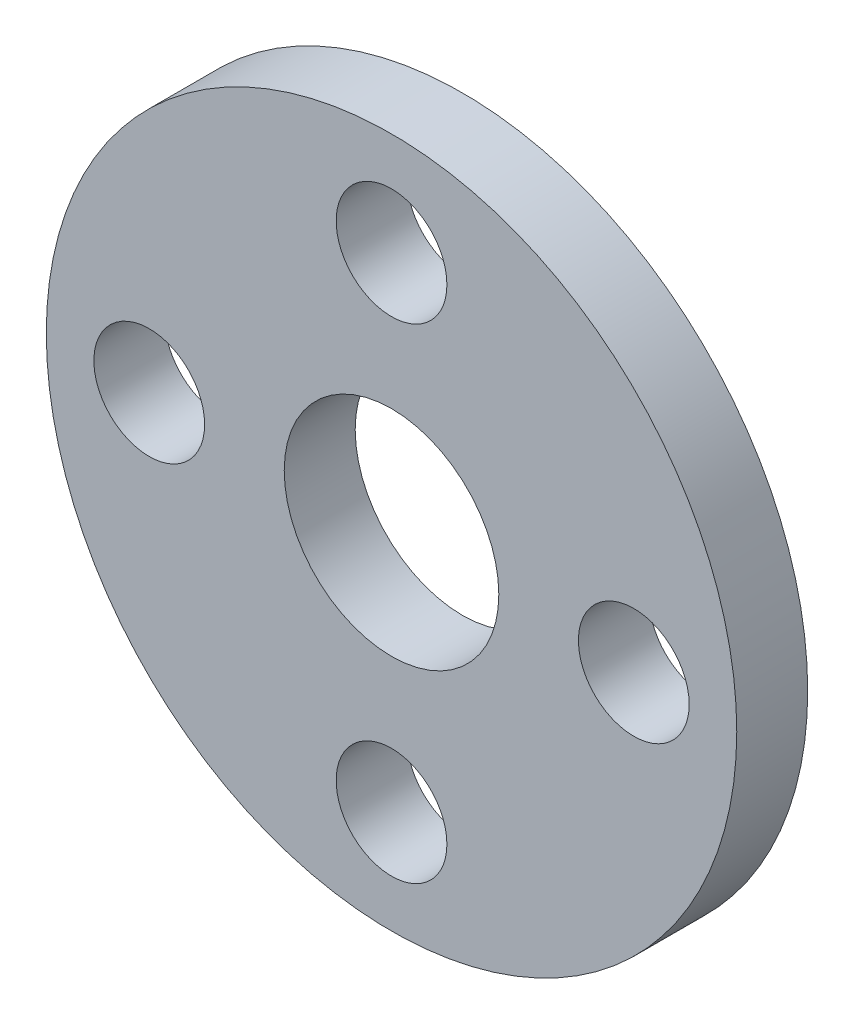
ISO-10303-21;
HEADER;
FILE_DESCRIPTION(('STEP AP214'),'2;1');
FILE_NAME('part.step','',(''),(''),'','','');
FILE_SCHEMA(('AUTOMOTIVE_DESIGN { 1 0 10303 214 1 1 1 1 }'));
ENDSEC;
DATA;
#1=APPLICATION_CONTEXT('core data for automotive mechanical design processes');
#2=APPLICATION_PROTOCOL_DEFINITION('international standard','automotive_design',2000,#1);
#3=PRODUCT_CONTEXT('',#1,'mechanical');
#4=PRODUCT('Part','Part','',(#3));
#5=PRODUCT_RELATED_PRODUCT_CATEGORY('part','',(#4));
#6=PRODUCT_DEFINITION_FORMATION('','',#4);
#7=PRODUCT_DEFINITION_CONTEXT('part definition',#1,'design');
#8=PRODUCT_DEFINITION('design','',#6,#7);
#9=PRODUCT_DEFINITION_SHAPE('','',#8);
#10=(LENGTH_UNIT() NAMED_UNIT(*) SI_UNIT(.MILLI.,.METRE.));
#11=(NAMED_UNIT(*) PLANE_ANGLE_UNIT() SI_UNIT($,.RADIAN.));
#12=(NAMED_UNIT(*) SI_UNIT($,.STERADIAN.) SOLID_ANGLE_UNIT());
#13=UNCERTAINTY_MEASURE_WITH_UNIT(LENGTH_MEASURE(1.E-05),#10,'distance_accuracy_value','');
#14=(GEOMETRIC_REPRESENTATION_CONTEXT(3) GLOBAL_UNCERTAINTY_ASSIGNED_CONTEXT((#13)) GLOBAL_UNIT_ASSIGNED_CONTEXT((#10,
#11,#12)) REPRESENTATION_CONTEXT('',''));
#15=CARTESIAN_POINT('',(0.,0.,0.));
#16=DIRECTION('',(0.,0.,1.));
#17=DIRECTION('',(1.,0.,0.));
#18=AXIS2_PLACEMENT_3D('',#15,#16,#17);
#19=CARTESIAN_POINT('',(0.,7.,-3.05));
#20=DIRECTION('',(0.,0.,1.));
#21=DIRECTION('',(1.,0.,0.));
#22=AXIS2_PLACEMENT_3D('',#19,#20,#21);
#23=CYLINDRICAL_SURFACE('',#22,1.6);
#24=CARTESIAN_POINT('',(0.,7.,0.));
#25=DIRECTION('',(0.,0.,1.));
#26=DIRECTION('',(1.,0.,0.));
#27=AXIS2_PLACEMENT_3D('',#24,#25,#26);
#28=CIRCLE('',#27,1.6);
#29=CARTESIAN_POINT('',(1.6,7.,0.));
#30=VERTEX_POINT('',#29);
#31=EDGE_CURVE('E49',#30,#30,#28,.T.);
#32=ORIENTED_EDGE('',*,*,#31,.T.);
#33=EDGE_LOOP('',(#32));
#34=FACE_BOUND('',#33,.T.);
#35=CARTESIAN_POINT('',(0.,7.,-2.05));
#36=DIRECTION('',(0.,0.,1.));
#37=DIRECTION('',(1.,0.,0.));
#38=AXIS2_PLACEMENT_3D('',#35,#36,#37);
#39=CIRCLE('',#38,1.6);
#40=CARTESIAN_POINT('',(1.6,7.,-2.05));
#41=VERTEX_POINT('',#40);
#42=EDGE_CURVE('E9',#41,#41,#39,.T.);
#43=ORIENTED_EDGE('',*,*,#42,.F.);
#44=EDGE_LOOP('',(#43));
#45=FACE_BOUND('',#44,.T.);
#46=ADVANCED_FACE('F14',(#34,#45),#23,.F.);
#47=CARTESIAN_POINT('',(7.,0.,-3.05));
#48=DIRECTION('',(0.,0.,1.));
#49=DIRECTION('',(1.,0.,0.));
#50=AXIS2_PLACEMENT_3D('',#47,#48,#49);
#51=CYLINDRICAL_SURFACE('',#50,1.6);
#52=CARTESIAN_POINT('',(7.,0.,0.));
#53=DIRECTION('',(0.,0.,1.));
#54=DIRECTION('',(1.,0.,0.));
#55=AXIS2_PLACEMENT_3D('',#52,#53,#54);
#56=CIRCLE('',#55,1.6);
#57=CARTESIAN_POINT('',(8.6,0.,0.));
#58=VERTEX_POINT('',#57);
#59=EDGE_CURVE('E45',#58,#58,#56,.T.);
#60=ORIENTED_EDGE('',*,*,#59,.T.);
#61=EDGE_LOOP('',(#60));
#62=FACE_BOUND('',#61,.T.);
#63=CARTESIAN_POINT('',(7.,0.,-2.05));
#64=DIRECTION('',(0.,0.,1.));
#65=DIRECTION('',(1.,0.,0.));
#66=AXIS2_PLACEMENT_3D('',#63,#64,#65);
#67=CIRCLE('',#66,1.6);
#68=CARTESIAN_POINT('',(8.6,0.,-2.05));
#69=VERTEX_POINT('',#68);
#70=EDGE_CURVE('E22',#69,#69,#67,.T.);
#71=ORIENTED_EDGE('',*,*,#70,.F.);
#72=EDGE_LOOP('',(#71));
#73=FACE_BOUND('',#72,.T.);
#74=ADVANCED_FACE('F104',(#62,#73),#51,.F.);
#75=CARTESIAN_POINT('',(0.,0.,-3.05));
#76=DIRECTION('',(0.,0.,1.));
#77=DIRECTION('',(1.,0.,0.));
#78=AXIS2_PLACEMENT_3D('',#75,#76,#77);
#79=CYLINDRICAL_SURFACE('',#78,3.1);
#80=CARTESIAN_POINT('',(0.,0.,0.));
#81=DIRECTION('',(0.,0.,1.));
#82=DIRECTION('',(1.,0.,0.));
#83=AXIS2_PLACEMENT_3D('',#80,#81,#82);
#84=CIRCLE('',#83,3.1);
#85=CARTESIAN_POINT('',(3.1,0.,0.));
#86=VERTEX_POINT('',#85);
#87=EDGE_CURVE('E41',#86,#86,#84,.T.);
#88=ORIENTED_EDGE('',*,*,#87,.T.);
#89=EDGE_LOOP('',(#88));
#90=FACE_BOUND('',#89,.T.);
#91=CARTESIAN_POINT('',(0.,0.,-2.05));
#92=DIRECTION('',(0.,0.,1.));
#93=DIRECTION('',(1.,0.,0.));
#94=AXIS2_PLACEMENT_3D('',#91,#92,#93);
#95=CIRCLE('',#94,3.1);
#96=CARTESIAN_POINT('',(3.1,0.,-2.05));
#97=VERTEX_POINT('',#96);
#98=EDGE_CURVE('E17',#97,#97,#95,.T.);
#99=ORIENTED_EDGE('',*,*,#98,.F.);
#100=EDGE_LOOP('',(#99));
#101=FACE_BOUND('',#100,.T.);
#102=ADVANCED_FACE('F108',(#90,#101),#79,.F.);
#103=CARTESIAN_POINT('',(-7.,0.,-3.05));
#104=DIRECTION('',(0.,0.,1.));
#105=DIRECTION('',(1.,0.,0.));
#106=AXIS2_PLACEMENT_3D('',#103,#104,#105);
#107=CYLINDRICAL_SURFACE('',#106,1.6);
#108=CARTESIAN_POINT('',(-7.,0.,0.));
#109=DIRECTION('',(0.,0.,1.));
#110=DIRECTION('',(1.,0.,0.));
#111=AXIS2_PLACEMENT_3D('',#108,#109,#110);
#112=CIRCLE('',#111,1.6);
#113=CARTESIAN_POINT('',(-5.4,0.,0.));
#114=VERTEX_POINT('',#113);
#115=EDGE_CURVE('E37',#114,#114,#112,.T.);
#116=ORIENTED_EDGE('',*,*,#115,.T.);
#117=EDGE_LOOP('',(#116));
#118=FACE_BOUND('',#117,.T.);
#119=CARTESIAN_POINT('',(-7.,0.,-2.05));
#120=DIRECTION('',(0.,0.,1.));
#121=DIRECTION('',(1.,0.,0.));
#122=AXIS2_PLACEMENT_3D('',#119,#120,#121);
#123=CIRCLE('',#122,1.6);
#124=CARTESIAN_POINT('',(-5.4,0.,-2.05));
#125=VERTEX_POINT('',#124);
#126=EDGE_CURVE('E50',#125,#125,#123,.T.);
#127=ORIENTED_EDGE('',*,*,#126,.F.);
#128=EDGE_LOOP('',(#127));
#129=FACE_BOUND('',#128,.T.);
#130=ADVANCED_FACE('F97',(#118,#129),#107,.F.);
#131=CARTESIAN_POINT('',(0.,-7.,-3.05));
#132=DIRECTION('',(0.,0.,1.));
#133=DIRECTION('',(1.,0.,0.));
#134=AXIS2_PLACEMENT_3D('',#131,#132,#133);
#135=CYLINDRICAL_SURFACE('',#134,1.6);
#136=CARTESIAN_POINT('',(0.,-7.,0.));
#137=DIRECTION('',(0.,0.,1.));
#138=DIRECTION('',(1.,0.,0.));
#139=AXIS2_PLACEMENT_3D('',#136,#137,#138);
#140=CIRCLE('',#139,1.6);
#141=CARTESIAN_POINT('',(1.6,-7.,0.));
#142=VERTEX_POINT('',#141);
#143=EDGE_CURVE('E34',#142,#142,#140,.T.);
#144=ORIENTED_EDGE('',*,*,#143,.T.);
#145=EDGE_LOOP('',(#144));
#146=FACE_BOUND('',#145,.T.);
#147=CARTESIAN_POINT('',(0.,-7.,-2.05));
#148=DIRECTION('',(0.,0.,1.));
#149=DIRECTION('',(1.,0.,0.));
#150=AXIS2_PLACEMENT_3D('',#147,#148,#149);
#151=CIRCLE('',#150,1.6);
#152=CARTESIAN_POINT('',(1.6,-7.,-2.05));
#153=VERTEX_POINT('',#152);
#154=EDGE_CURVE('E53',#153,#153,#151,.T.);
#155=ORIENTED_EDGE('',*,*,#154,.F.);
#156=EDGE_LOOP('',(#155));
#157=FACE_BOUND('',#156,.T.);
#158=ADVANCED_FACE('F88',(#146,#157),#135,.F.);
#159=CARTESIAN_POINT('',(0.,0.,-2.05));
#160=DIRECTION('',(0.,0.,1.));
#161=DIRECTION('',(1.,0.,0.));
#162=AXIS2_PLACEMENT_3D('',#159,#160,#161);
#163=PLANE('',#162);
#164=ORIENTED_EDGE('',*,*,#42,.T.);
#165=EDGE_LOOP('',(#164));
#166=FACE_BOUND('',#165,.T.);
#167=ORIENTED_EDGE('',*,*,#70,.T.);
#168=EDGE_LOOP('',(#167));
#169=FACE_BOUND('',#168,.T.);
#170=ORIENTED_EDGE('',*,*,#98,.T.);
#171=EDGE_LOOP('',(#170));
#172=FACE_BOUND('',#171,.T.);
#173=ORIENTED_EDGE('',*,*,#126,.T.);
#174=EDGE_LOOP('',(#173));
#175=FACE_BOUND('',#174,.T.);
#176=ORIENTED_EDGE('',*,*,#154,.T.);
#177=EDGE_LOOP('',(#176));
#178=FACE_BOUND('',#177,.T.);
#179=CARTESIAN_POINT('',(0.,0.,-2.05));
#180=DIRECTION('',(0.,0.,1.));
#181=DIRECTION('',(1.,0.,0.));
#182=AXIS2_PLACEMENT_3D('',#179,#180,#181);
#183=CIRCLE('',#182,9.975);
#184=CARTESIAN_POINT('',(9.975,0.,-2.05));
#185=VERTEX_POINT('',#184);
#186=EDGE_CURVE('E67',#185,#185,#183,.T.);
#187=ORIENTED_EDGE('',*,*,#186,.F.);
#188=EDGE_LOOP('',(#187));
#189=FACE_BOUND('',#188,.T.);
#190=ADVANCED_FACE('F86',(#166,#169,#172,#175,#178,#189),#163,.F.);
#191=CARTESIAN_POINT('',(0.,0.,0.));
#192=DIRECTION('',(0.,0.,1.));
#193=DIRECTION('',(1.,0.,0.));
#194=AXIS2_PLACEMENT_3D('',#191,#192,#193);
#195=PLANE('',#194);
#196=ORIENTED_EDGE('',*,*,#31,.F.);
#197=EDGE_LOOP('',(#196));
#198=FACE_BOUND('',#197,.T.);
#199=ORIENTED_EDGE('',*,*,#59,.F.);
#200=EDGE_LOOP('',(#199));
#201=FACE_BOUND('',#200,.T.);
#202=ORIENTED_EDGE('',*,*,#87,.F.);
#203=EDGE_LOOP('',(#202));
#204=FACE_BOUND('',#203,.T.);
#205=ORIENTED_EDGE('',*,*,#115,.F.);
#206=EDGE_LOOP('',(#205));
#207=FACE_BOUND('',#206,.T.);
#208=ORIENTED_EDGE('',*,*,#143,.F.);
#209=EDGE_LOOP('',(#208));
#210=FACE_BOUND('',#209,.T.);
#211=CARTESIAN_POINT('',(0.,0.,0.));
#212=DIRECTION('',(0.,0.,1.));
#213=DIRECTION('',(1.,0.,0.));
#214=AXIS2_PLACEMENT_3D('',#211,#212,#213);
#215=CIRCLE('',#214,9.975);
#216=CARTESIAN_POINT('',(9.975,0.,0.));
#217=VERTEX_POINT('',#216);
#218=EDGE_CURVE('E71',#217,#217,#215,.T.);
#219=ORIENTED_EDGE('',*,*,#218,.T.);
#220=EDGE_LOOP('',(#219));
#221=FACE_BOUND('',#220,.T.);
#222=ADVANCED_FACE('F78',(#198,#201,#204,#207,#210,#221),#195,.T.);
#223=CARTESIAN_POINT('',(0.,0.,-2.05));
#224=DIRECTION('',(0.,0.,1.));
#225=DIRECTION('',(1.,0.,0.));
#226=AXIS2_PLACEMENT_3D('',#223,#224,#225);
#227=CYLINDRICAL_SURFACE('',#226,9.975);
#228=ORIENTED_EDGE('',*,*,#218,.F.);
#229=EDGE_LOOP('',(#228));
#230=FACE_BOUND('',#229,.T.);
#231=ORIENTED_EDGE('',*,*,#186,.T.);
#232=EDGE_LOOP('',(#231));
#233=FACE_BOUND('',#232,.T.);
#234=ADVANCED_FACE('F80',(#230,#233),#227,.T.);
#235=CLOSED_SHELL('',(#46,#74,#102,#130,#158,#190,#222,#234));
#236=MANIFOLD_SOLID_BREP('B1',#235);
#237=ADVANCED_BREP_SHAPE_REPRESENTATION('',(#18,#236),#14);
#238=SHAPE_DEFINITION_REPRESENTATION(#9,#237);
ENDSEC;
END-ISO-10303-21;
